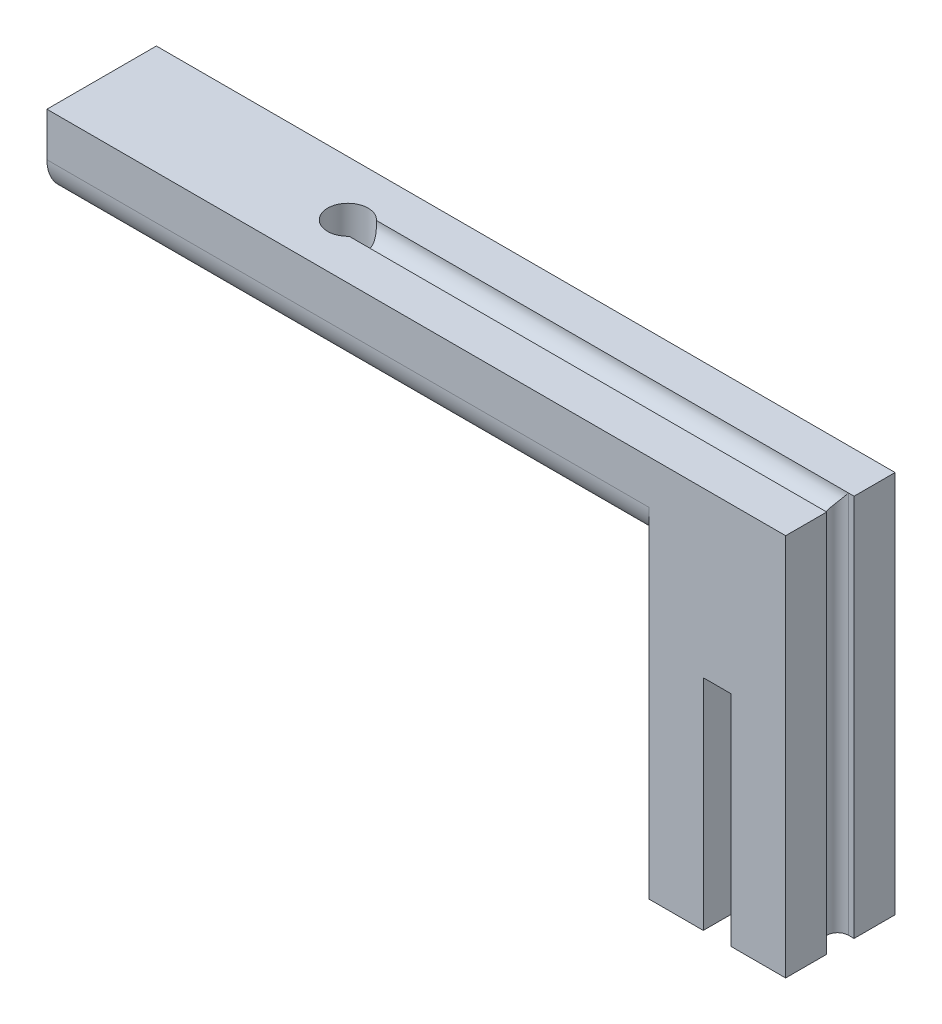
ISO-10303-21;
HEADER;
FILE_DESCRIPTION(('STEP AP214'),'2;1');
FILE_NAME('part.step','',(''),(''),'','','');
FILE_SCHEMA(('AUTOMOTIVE_DESIGN { 1 0 10303 214 1 1 1 1 }'));
ENDSEC;
DATA;
#1=APPLICATION_CONTEXT('core data for automotive mechanical design processes');
#2=APPLICATION_PROTOCOL_DEFINITION('international standard','automotive_design',2000,#1);
#3=PRODUCT_CONTEXT('',#1,'mechanical');
#4=PRODUCT('Part','Part','',(#3));
#5=PRODUCT_RELATED_PRODUCT_CATEGORY('part','',(#4));
#6=PRODUCT_DEFINITION_FORMATION('','',#4);
#7=PRODUCT_DEFINITION_CONTEXT('part definition',#1,'design');
#8=PRODUCT_DEFINITION('design','',#6,#7);
#9=PRODUCT_DEFINITION_SHAPE('','',#8);
#10=(LENGTH_UNIT() NAMED_UNIT(*) SI_UNIT(.MILLI.,.METRE.));
#11=(NAMED_UNIT(*) PLANE_ANGLE_UNIT() SI_UNIT($,.RADIAN.));
#12=(NAMED_UNIT(*) SI_UNIT($,.STERADIAN.) SOLID_ANGLE_UNIT());
#13=UNCERTAINTY_MEASURE_WITH_UNIT(LENGTH_MEASURE(1.E-05),#10,'distance_accuracy_value','');
#14=(GEOMETRIC_REPRESENTATION_CONTEXT(3) GLOBAL_UNCERTAINTY_ASSIGNED_CONTEXT((#13)) GLOBAL_UNIT_ASSIGNED_CONTEXT((#10,
#11,#12)) REPRESENTATION_CONTEXT('',''));
#15=CARTESIAN_POINT('',(0.,0.,0.));
#16=DIRECTION('',(0.,0.,1.));
#17=DIRECTION('',(1.,0.,0.));
#18=AXIS2_PLACEMENT_3D('',#15,#16,#17);
#19=CARTESIAN_POINT('',(0.,0.,20.));
#20=DIRECTION('',(-1.,0.,0.));
#21=DIRECTION('',(0.,0.,1.));
#22=AXIS2_PLACEMENT_3D('',#19,#20,#21);
#23=PLANE('',#22);
#24=DIRECTION('',(0.,0.,-1.));
#25=VECTOR('',#24,1.);
#26=CARTESIAN_POINT('',(0.,0.,20.));
#27=LINE('',#26,#25);
#28=CARTESIAN_POINT('',(0.,0.,20.));
#29=VERTEX_POINT('',#28);
#30=CARTESIAN_POINT('',(0.,0.,12.5));
#31=VERTEX_POINT('',#30);
#32=EDGE_CURVE('E267',#29,#31,#27,.T.);
#33=ORIENTED_EDGE('',*,*,#32,.T.);
#34=DIRECTION('',(0.,1.,0.));
#35=VECTOR('',#34,1.);
#36=CARTESIAN_POINT('',(0.,-5.83095189484531,12.5));
#37=LINE('',#36,#35);
#38=CARTESIAN_POINT('',(0.,70.,12.5));
#39=VERTEX_POINT('',#38);
#40=EDGE_CURVE('E121',#31,#39,#37,.T.);
#41=ORIENTED_EDGE('',*,*,#40,.T.);
#42=DIRECTION('',(0.,0.,-1.));
#43=VECTOR('',#42,1.);
#44=CARTESIAN_POINT('',(0.,70.,20.));
#45=LINE('',#44,#43);
#46=CARTESIAN_POINT('',(0.,70.,20.));
#47=VERTEX_POINT('',#46);
#48=EDGE_CURVE('E289',#47,#39,#45,.T.);
#49=ORIENTED_EDGE('',*,*,#48,.F.);
#50=DIRECTION('',(0.,1.,0.));
#51=VECTOR('',#50,1.);
#52=CARTESIAN_POINT('',(0.,0.,20.));
#53=LINE('',#52,#51);
#54=EDGE_CURVE('E274',#29,#47,#53,.T.);
#55=ORIENTED_EDGE('',*,*,#54,.F.);
#56=EDGE_LOOP('',(#33,#41,#49,#55));
#57=FACE_BOUND('',#56,.T.);
#58=ADVANCED_FACE('F44',(#57),#23,.F.);
#59=CARTESIAN_POINT('',(-135.,55.,20.));
#60=DIRECTION('',(0.,1.,0.));
#61=DIRECTION('',(0.,0.,1.));
#62=AXIS2_PLACEMENT_3D('',#59,#60,#61);
#63=PLANE('',#62);
#64=DIRECTION('',(1.,0.,0.));
#65=VECTOR('',#64,1.);
#66=CARTESIAN_POINT('',(-135.,55.,13.));
#67=LINE('',#66,#65);
#68=CARTESIAN_POINT('',(-25.,55.,13.));
#69=VERTEX_POINT('',#68);
#70=CARTESIAN_POINT('',(-87.8343592172293,55.,13.));
#71=VERTEX_POINT('',#70);
#72=EDGE_CURVE('E286',#69,#71,#67,.F.);
#73=ORIENTED_EDGE('',*,*,#72,.T.);
#74=CARTESIAN_POINT('',(-90.,55.,10.));
#75=DIRECTION('',(0.,1.,0.));
#76=DIRECTION('',(0.,0.,1.));
#77=AXIS2_PLACEMENT_3D('',#74,#75,#76);
#78=CIRCLE('',#77,3.69999999999999);
#79=CARTESIAN_POINT('',(-87.8343592172293,55.,7.));
#80=VERTEX_POINT('',#79);
#81=EDGE_CURVE('E338',#80,#71,#78,.F.);
#82=ORIENTED_EDGE('',*,*,#81,.F.);
#83=DIRECTION('',(1.,0.,0.));
#84=VECTOR('',#83,1.);
#85=CARTESIAN_POINT('',(-135.,55.,7.));
#86=LINE('',#85,#84);
#87=CARTESIAN_POINT('',(-25.,55.,7.));
#88=VERTEX_POINT('',#87);
#89=EDGE_CURVE('E295',#80,#88,#86,.T.);
#90=ORIENTED_EDGE('',*,*,#89,.T.);
#91=DIRECTION('',(0.,0.,-1.));
#92=VECTOR('',#91,1.);
#93=CARTESIAN_POINT('',(-25.,55.,20.));
#94=LINE('',#93,#92);
#95=EDGE_CURVE('E404',#69,#88,#94,.T.);
#96=ORIENTED_EDGE('',*,*,#95,.F.);
#97=EDGE_LOOP('',(#73,#82,#90,#96));
#98=FACE_BOUND('',#97,.T.);
#99=ADVANCED_FACE('F234',(#98),#63,.F.);
#100=CARTESIAN_POINT('',(-25.,0.,20.));
#101=DIRECTION('',(0.,1.,0.));
#102=DIRECTION('',(0.,0.,1.));
#103=AXIS2_PLACEMENT_3D('',#100,#101,#102);
#104=PLANE('',#103);
#105=DIRECTION('',(1.,0.,0.));
#106=VECTOR('',#105,1.);
#107=CARTESIAN_POINT('',(-25.,0.,0.));
#108=LINE('',#107,#106);
#109=CARTESIAN_POINT('',(-25.,0.,0.));
#110=VERTEX_POINT('',#109);
#111=CARTESIAN_POINT('',(-15.05,0.,0.));
#112=VERTEX_POINT('',#111);
#113=EDGE_CURVE('E380',#110,#112,#108,.T.);
#114=ORIENTED_EDGE('',*,*,#113,.T.);
#115=DIRECTION('',(0.,0.,1.));
#116=VECTOR('',#115,1.);
#117=CARTESIAN_POINT('',(-15.05,0.,-40.3238143037089));
#118=LINE('',#117,#116);
#119=CARTESIAN_POINT('',(-15.05,0.,20.));
#120=VERTEX_POINT('',#119);
#121=EDGE_CURVE('E486',#112,#120,#118,.T.);
#122=ORIENTED_EDGE('',*,*,#121,.T.);
#123=DIRECTION('',(1.,0.,0.));
#124=VECTOR('',#123,1.);
#125=CARTESIAN_POINT('',(-25.,0.,20.));
#126=LINE('',#125,#124);
#127=CARTESIAN_POINT('',(-25.,0.,20.));
#128=VERTEX_POINT('',#127);
#129=EDGE_CURVE('E518',#128,#120,#126,.T.);
#130=ORIENTED_EDGE('',*,*,#129,.F.);
#131=DIRECTION('',(0.,0.,-1.));
#132=VECTOR('',#131,1.);
#133=CARTESIAN_POINT('',(-25.,0.,20.));
#134=LINE('',#133,#132);
#135=EDGE_CURVE('E375',#128,#110,#134,.T.);
#136=ORIENTED_EDGE('',*,*,#135,.T.);
#137=EDGE_LOOP('',(#114,#122,#130,#136));
#138=FACE_BOUND('',#137,.T.);
#139=ADVANCED_FACE('F218',(#138),#104,.F.);
#140=DIRECTION('',(0.,0.,-1.));
#141=VECTOR('',#140,1.);
#142=CARTESIAN_POINT('',(-3.,0.,7.5));
#143=LINE('',#142,#141);
#144=CARTESIAN_POINT('',(-3.,0.,10.5));
#145=VERTEX_POINT('',#144);
#146=CARTESIAN_POINT('',(-3.,0.,9.5));
#147=VERTEX_POINT('',#146);
#148=EDGE_CURVE('E105',#145,#147,#143,.T.);
#149=ORIENTED_EDGE('',*,*,#148,.F.);
#150=CARTESIAN_POINT('',(-1.,0.,10.5));
#151=DIRECTION('',(0.,1.,0.));
#152=DIRECTION('',(0.,0.,1.));
#153=AXIS2_PLACEMENT_3D('',#150,#151,#152);
#154=CIRCLE('',#153,2.);
#155=CARTESIAN_POINT('',(-1.,0.,12.5));
#156=VERTEX_POINT('',#155);
#157=EDGE_CURVE('E94',#145,#156,#154,.T.);
#158=ORIENTED_EDGE('',*,*,#157,.T.);
#159=DIRECTION('',(-1.,0.,0.));
#160=VECTOR('',#159,1.);
#161=CARTESIAN_POINT('',(0.,0.,12.5));
#162=LINE('',#161,#160);
#163=EDGE_CURVE('E120',#31,#156,#162,.T.);
#164=ORIENTED_EDGE('',*,*,#163,.F.);
#165=ORIENTED_EDGE('',*,*,#32,.F.);
#166=CARTESIAN_POINT('',(-9.95,0.,20.));
#167=VERTEX_POINT('',#166);
#168=EDGE_CURVE('E400',#167,#29,#126,.T.);
#169=ORIENTED_EDGE('',*,*,#168,.F.);
#170=DIRECTION('',(0.,0.,1.));
#171=VECTOR('',#170,1.);
#172=CARTESIAN_POINT('',(-9.95,0.,-40.3238143037089));
#173=LINE('',#172,#171);
#174=CARTESIAN_POINT('',(-9.95,0.,0.));
#175=VERTEX_POINT('',#174);
#176=EDGE_CURVE('E513',#175,#167,#173,.T.);
#177=ORIENTED_EDGE('',*,*,#176,.F.);
#178=CARTESIAN_POINT('',(0.,0.,0.));
#179=VERTEX_POINT('',#178);
#180=EDGE_CURVE('E385',#175,#179,#108,.T.);
#181=ORIENTED_EDGE('',*,*,#180,.T.);
#182=CARTESIAN_POINT('',(0.,0.,7.5));
#183=VERTEX_POINT('',#182);
#184=EDGE_CURVE('E281',#183,#179,#27,.T.);
#185=ORIENTED_EDGE('',*,*,#184,.F.);
#186=DIRECTION('',(1.,0.,0.));
#187=VECTOR('',#186,1.);
#188=CARTESIAN_POINT('',(0.,0.,7.5));
#189=LINE('',#188,#187);
#190=CARTESIAN_POINT('',(-1.,0.,7.5));
#191=VERTEX_POINT('',#190);
#192=EDGE_CURVE('E107',#191,#183,#189,.T.);
#193=ORIENTED_EDGE('',*,*,#192,.F.);
#194=CARTESIAN_POINT('',(-1.,0.,9.5));
#195=DIRECTION('',(0.,1.,0.));
#196=DIRECTION('',(0.,0.,1.));
#197=AXIS2_PLACEMENT_3D('',#194,#195,#196);
#198=CIRCLE('',#197,2.);
#199=EDGE_CURVE('E11',#191,#147,#198,.T.);
#200=ORIENTED_EDGE('',*,*,#199,.T.);
#201=EDGE_LOOP('',(#149,#158,#164,#165,#169,#177,#181,#185,#193,#200));
#202=FACE_BOUND('',#201,.T.);
#203=ADVANCED_FACE('F104',(#202),#104,.F.);
#204=CARTESIAN_POINT('',(0.,70.,7.5));
#205=VERTEX_POINT('',#204);
#206=CARTESIAN_POINT('',(0.,70.,0.));
#207=VERTEX_POINT('',#206);
#208=EDGE_CURVE('E410',#205,#207,#45,.T.);
#209=ORIENTED_EDGE('',*,*,#208,.F.);
#210=DIRECTION('',(0.,1.,0.));
#211=VECTOR('',#210,1.);
#212=CARTESIAN_POINT('',(0.,-5.83095189484531,7.5));
#213=LINE('',#212,#211);
#214=EDGE_CURVE('E528',#183,#205,#213,.T.);
#215=ORIENTED_EDGE('',*,*,#214,.F.);
#216=ORIENTED_EDGE('',*,*,#184,.T.);
#217=DIRECTION('',(0.,1.,0.));
#218=VECTOR('',#217,1.);
#219=CARTESIAN_POINT('',(0.,0.,0.));
#220=LINE('',#219,#218);
#221=EDGE_CURVE('E384',#179,#207,#220,.T.);
#222=ORIENTED_EDGE('',*,*,#221,.T.);
#223=EDGE_LOOP('',(#209,#215,#216,#222));
#224=FACE_BOUND('',#223,.T.);
#225=ADVANCED_FACE('F217',(#224),#23,.F.);
#226=CARTESIAN_POINT('',(0.,70.,20.));
#227=DIRECTION('',(0.,-1.,0.));
#228=DIRECTION('',(1.,0.,0.));
#229=AXIS2_PLACEMENT_3D('',#226,#227,#228);
#230=PLANE('',#229);
#231=CARTESIAN_POINT('',(-90.,70.,10.));
#232=DIRECTION('',(0.,1.,0.));
#233=DIRECTION('',(-1.,0.,0.));
#234=AXIS2_PLACEMENT_3D('',#231,#232,#233);
#235=CIRCLE('',#234,3.69999999999999);
#236=CARTESIAN_POINT('',(-87.2723636606028,70.,7.5));
#237=VERTEX_POINT('',#236);
#238=CARTESIAN_POINT('',(-87.2723636606028,70.,12.5));
#239=VERTEX_POINT('',#238);
#240=EDGE_CURVE('E547',#237,#239,#235,.T.);
#241=ORIENTED_EDGE('',*,*,#240,.F.);
#242=DIRECTION('',(-1.,0.,0.));
#243=VECTOR('',#242,1.);
#244=CARTESIAN_POINT('',(-87.2723636606028,70.,7.5));
#245=LINE('',#244,#243);
#246=CARTESIAN_POINT('',(-1.,70.,7.5));
#247=VERTEX_POINT('',#246);
#248=EDGE_CURVE('E61',#247,#237,#245,.T.);
#249=ORIENTED_EDGE('',*,*,#248,.F.);
#250=EDGE_CURVE('E545',#205,#247,#245,.T.);
#251=ORIENTED_EDGE('',*,*,#250,.F.);
#252=ORIENTED_EDGE('',*,*,#208,.T.);
#253=DIRECTION('',(-1.,0.,0.));
#254=VECTOR('',#253,1.);
#255=CARTESIAN_POINT('',(0.,70.,0.));
#256=LINE('',#255,#254);
#257=CARTESIAN_POINT('',(-135.,70.,0.));
#258=VERTEX_POINT('',#257);
#259=EDGE_CURVE('E389',#207,#258,#256,.T.);
#260=ORIENTED_EDGE('',*,*,#259,.T.);
#261=DIRECTION('',(0.,0.,-1.));
#262=VECTOR('',#261,1.);
#263=CARTESIAN_POINT('',(-135.,70.,20.));
#264=LINE('',#263,#262);
#265=CARTESIAN_POINT('',(-135.,70.,20.));
#266=VERTEX_POINT('',#265);
#267=EDGE_CURVE('E408',#266,#258,#264,.T.);
#268=ORIENTED_EDGE('',*,*,#267,.F.);
#269=DIRECTION('',(-1.,0.,0.));
#270=VECTOR('',#269,1.);
#271=CARTESIAN_POINT('',(0.,70.,20.));
#272=LINE('',#271,#270);
#273=EDGE_CURVE('E368',#47,#266,#272,.T.);
#274=ORIENTED_EDGE('',*,*,#273,.F.);
#275=ORIENTED_EDGE('',*,*,#48,.T.);
#276=DIRECTION('',(1.,0.,0.));
#277=VECTOR('',#276,1.);
#278=CARTESIAN_POINT('',(0.,70.,12.5));
#279=LINE('',#278,#277);
#280=CARTESIAN_POINT('',(-1.,70.,12.5));
#281=VERTEX_POINT('',#280);
#282=EDGE_CURVE('E420',#281,#39,#279,.T.);
#283=ORIENTED_EDGE('',*,*,#282,.F.);
#284=DIRECTION('',(1.,0.,0.));
#285=VECTOR('',#284,1.);
#286=CARTESIAN_POINT('',(-87.2723636606028,70.,12.5));
#287=LINE('',#286,#285);
#288=EDGE_CURVE('E83',#239,#281,#287,.T.);
#289=ORIENTED_EDGE('',*,*,#288,.F.);
#290=EDGE_LOOP('',(#241,#249,#251,#252,#260,#268,#274,#275,#283,#289));
#291=FACE_BOUND('',#290,.T.);
#292=ADVANCED_FACE('F221',(#291),#230,.F.);
#293=CARTESIAN_POINT('',(-135.,70.,20.));
#294=DIRECTION('',(1.,0.,0.));
#295=DIRECTION('',(0.,0.,-1.));
#296=AXIS2_PLACEMENT_3D('',#293,#294,#295);
#297=PLANE('',#296);
#298=DIRECTION('',(0.,-1.,0.));
#299=VECTOR('',#298,1.);
#300=CARTESIAN_POINT('',(-135.,70.,0.));
#301=LINE('',#300,#299);
#302=CARTESIAN_POINT('',(-135.,62.,0.));
#303=VERTEX_POINT('',#302);
#304=EDGE_CURVE('E393',#258,#303,#301,.T.);
#305=ORIENTED_EDGE('',*,*,#304,.T.);
#306=CARTESIAN_POINT('',(-135.,62.,7.));
#307=DIRECTION('',(1.,0.,0.));
#308=DIRECTION('',(0.,0.,-1.));
#309=AXIS2_PLACEMENT_3D('',#306,#307,#308);
#310=CIRCLE('',#309,7.);
#311=CARTESIAN_POINT('',(-135.,55.,7.));
#312=VERTEX_POINT('',#311);
#313=EDGE_CURVE('E308',#303,#312,#310,.F.);
#314=ORIENTED_EDGE('',*,*,#313,.T.);
#315=DIRECTION('',(0.,0.,-1.));
#316=VECTOR('',#315,1.);
#317=CARTESIAN_POINT('',(-135.,55.,20.));
#318=LINE('',#317,#316);
#319=CARTESIAN_POINT('',(-135.,55.,13.));
#320=VERTEX_POINT('',#319);
#321=EDGE_CURVE('E361',#320,#312,#318,.T.);
#322=ORIENTED_EDGE('',*,*,#321,.F.);
#323=CARTESIAN_POINT('',(-135.,62.,13.));
#324=DIRECTION('',(1.,0.,0.));
#325=DIRECTION('',(0.,0.,-1.));
#326=AXIS2_PLACEMENT_3D('',#323,#324,#325);
#327=CIRCLE('',#326,7.);
#328=CARTESIAN_POINT('',(-135.,62.,20.));
#329=VERTEX_POINT('',#328);
#330=EDGE_CURVE('E304',#320,#329,#327,.F.);
#331=ORIENTED_EDGE('',*,*,#330,.T.);
#332=DIRECTION('',(0.,-1.,0.));
#333=VECTOR('',#332,1.);
#334=CARTESIAN_POINT('',(-135.,70.,20.));
#335=LINE('',#334,#333);
#336=EDGE_CURVE('E360',#266,#329,#335,.T.);
#337=ORIENTED_EDGE('',*,*,#336,.F.);
#338=ORIENTED_EDGE('',*,*,#267,.T.);
#339=EDGE_LOOP('',(#305,#314,#322,#331,#337,#338));
#340=FACE_BOUND('',#339,.T.);
#341=ADVANCED_FACE('F225',(#340),#297,.F.);
#342=CARTESIAN_POINT('',(-92.1656407827708,55.,7.));
#343=VERTEX_POINT('',#342);
#344=EDGE_CURVE('E296',#312,#343,#86,.T.);
#345=ORIENTED_EDGE('',*,*,#344,.T.);
#346=CARTESIAN_POINT('',(-92.1656407827708,55.,13.));
#347=VERTEX_POINT('',#346);
#348=EDGE_CURVE('E205',#347,#343,#78,.F.);
#349=ORIENTED_EDGE('',*,*,#348,.F.);
#350=EDGE_CURVE('E280',#347,#320,#67,.F.);
#351=ORIENTED_EDGE('',*,*,#350,.T.);
#352=ORIENTED_EDGE('',*,*,#321,.T.);
#353=EDGE_LOOP('',(#345,#349,#351,#352));
#354=FACE_BOUND('',#353,.T.);
#355=ADVANCED_FACE('F228',(#354),#63,.F.);
#356=CARTESIAN_POINT('',(-25.,55.,20.));
#357=DIRECTION('',(1.,0.,0.));
#358=DIRECTION('',(0.,1.,0.));
#359=AXIS2_PLACEMENT_3D('',#356,#357,#358);
#360=PLANE('',#359);
#361=DIRECTION('',(0.,-1.,0.));
#362=VECTOR('',#361,1.);
#363=CARTESIAN_POINT('',(-25.,55.,0.));
#364=LINE('',#363,#362);
#365=CARTESIAN_POINT('',(-25.,62.,0.));
#366=VERTEX_POINT('',#365);
#367=EDGE_CURVE('E396',#366,#110,#364,.T.);
#368=ORIENTED_EDGE('',*,*,#367,.T.);
#369=ORIENTED_EDGE('',*,*,#135,.F.);
#370=DIRECTION('',(0.,-1.,0.));
#371=VECTOR('',#370,1.);
#372=CARTESIAN_POINT('',(-25.,55.,20.));
#373=LINE('',#372,#371);
#374=CARTESIAN_POINT('',(-25.,62.,20.));
#375=VERTEX_POINT('',#374);
#376=EDGE_CURVE('E371',#375,#128,#373,.T.);
#377=ORIENTED_EDGE('',*,*,#376,.F.);
#378=CARTESIAN_POINT('',(-25.,62.,13.));
#379=DIRECTION('',(1.,0.,0.));
#380=DIRECTION('',(0.,1.,0.));
#381=AXIS2_PLACEMENT_3D('',#378,#379,#380);
#382=CIRCLE('',#381,7.);
#383=EDGE_CURVE('E319',#375,#69,#382,.T.);
#384=ORIENTED_EDGE('',*,*,#383,.T.);
#385=ORIENTED_EDGE('',*,*,#95,.T.);
#386=CARTESIAN_POINT('',(-25.,62.,7.));
#387=DIRECTION('',(1.,0.,0.));
#388=DIRECTION('',(0.,1.,0.));
#389=AXIS2_PLACEMENT_3D('',#386,#387,#388);
#390=CIRCLE('',#389,7.);
#391=EDGE_CURVE('E316',#88,#366,#390,.T.);
#392=ORIENTED_EDGE('',*,*,#391,.T.);
#393=EDGE_LOOP('',(#368,#369,#377,#384,#385,#392));
#394=FACE_BOUND('',#393,.T.);
#395=ADVANCED_FACE('F232',(#394),#360,.F.);
#396=CARTESIAN_POINT('',(0.,0.,20.));
#397=DIRECTION('',(0.,0.,1.));
#398=DIRECTION('',(1.,0.,0.));
#399=AXIS2_PLACEMENT_3D('',#396,#397,#398);
#400=PLANE('',#399);
#401=ORIENTED_EDGE('',*,*,#336,.T.);
#402=DIRECTION('',(1.,0.,0.));
#403=VECTOR('',#402,1.);
#404=CARTESIAN_POINT('',(-25.,62.,20.));
#405=LINE('',#404,#403);
#406=EDGE_CURVE('E312',#329,#375,#405,.T.);
#407=ORIENTED_EDGE('',*,*,#406,.T.);
#408=ORIENTED_EDGE('',*,*,#376,.T.);
#409=ORIENTED_EDGE('',*,*,#129,.T.);
#410=DIRECTION('',(0.,-1.,0.));
#411=VECTOR('',#410,1.);
#412=CARTESIAN_POINT('',(-15.05,0.,20.));
#413=LINE('',#412,#411);
#414=CARTESIAN_POINT('',(-15.05,40.,20.));
#415=VERTEX_POINT('',#414);
#416=EDGE_CURVE('E204',#415,#120,#413,.T.);
#417=ORIENTED_EDGE('',*,*,#416,.F.);
#418=DIRECTION('',(-1.,0.,0.));
#419=VECTOR('',#418,1.);
#420=CARTESIAN_POINT('',(-15.05,40.,20.));
#421=LINE('',#420,#419);
#422=CARTESIAN_POINT('',(-9.95,40.,20.));
#423=VERTEX_POINT('',#422);
#424=EDGE_CURVE('E494',#423,#415,#421,.T.);
#425=ORIENTED_EDGE('',*,*,#424,.F.);
#426=DIRECTION('',(0.,1.,0.));
#427=VECTOR('',#426,1.);
#428=CARTESIAN_POINT('',(-9.95,0.,20.));
#429=LINE('',#428,#427);
#430=EDGE_CURVE('E505',#167,#423,#429,.T.);
#431=ORIENTED_EDGE('',*,*,#430,.F.);
#432=ORIENTED_EDGE('',*,*,#168,.T.);
#433=ORIENTED_EDGE('',*,*,#54,.T.);
#434=ORIENTED_EDGE('',*,*,#273,.T.);
#435=EDGE_LOOP('',(#401,#407,#408,#409,#417,#425,#431,#432,#433,#434));
#436=FACE_BOUND('',#435,.T.);
#437=ADVANCED_FACE('F237',(#436),#400,.T.);
#438=CARTESIAN_POINT('',(0.,0.,0.));
#439=DIRECTION('',(0.,0.,1.));
#440=DIRECTION('',(1.,0.,0.));
#441=AXIS2_PLACEMENT_3D('',#438,#439,#440);
#442=PLANE('',#441);
#443=ORIENTED_EDGE('',*,*,#367,.F.);
#444=DIRECTION('',(1.,0.,0.));
#445=VECTOR('',#444,1.);
#446=CARTESIAN_POINT('',(0.,62.,0.));
#447=LINE('',#446,#445);
#448=EDGE_CURVE('E300',#366,#303,#447,.F.);
#449=ORIENTED_EDGE('',*,*,#448,.T.);
#450=ORIENTED_EDGE('',*,*,#304,.F.);
#451=ORIENTED_EDGE('',*,*,#259,.F.);
#452=ORIENTED_EDGE('',*,*,#221,.F.);
#453=ORIENTED_EDGE('',*,*,#180,.F.);
#454=DIRECTION('',(0.,-1.,0.));
#455=VECTOR('',#454,1.);
#456=CARTESIAN_POINT('',(-9.95,0.,0.));
#457=LINE('',#456,#455);
#458=CARTESIAN_POINT('',(-9.95,40.,0.));
#459=VERTEX_POINT('',#458);
#460=EDGE_CURVE('E207',#459,#175,#457,.T.);
#461=ORIENTED_EDGE('',*,*,#460,.F.);
#462=DIRECTION('',(1.,0.,0.));
#463=VECTOR('',#462,1.);
#464=CARTESIAN_POINT('',(-15.05,40.,0.));
#465=LINE('',#464,#463);
#466=CARTESIAN_POINT('',(-15.05,40.,0.));
#467=VERTEX_POINT('',#466);
#468=EDGE_CURVE('E489',#467,#459,#465,.T.);
#469=ORIENTED_EDGE('',*,*,#468,.F.);
#470=DIRECTION('',(0.,1.,0.));
#471=VECTOR('',#470,1.);
#472=CARTESIAN_POINT('',(-15.05,0.,0.));
#473=LINE('',#472,#471);
#474=EDGE_CURVE('E481',#112,#467,#473,.T.);
#475=ORIENTED_EDGE('',*,*,#474,.F.);
#476=ORIENTED_EDGE('',*,*,#113,.F.);
#477=EDGE_LOOP('',(#443,#449,#450,#451,#452,#453,#461,#469,#475,#476));
#478=FACE_BOUND('',#477,.T.);
#479=ADVANCED_FACE('F239',(#478),#442,.F.);
#480=CARTESIAN_POINT('',(-15.05,0.,-40.3238143037089));
#481=DIRECTION('',(-1.,0.,0.));
#482=DIRECTION('',(0.,-1.,0.));
#483=AXIS2_PLACEMENT_3D('',#480,#481,#482);
#484=PLANE('',#483);
#485=ORIENTED_EDGE('',*,*,#474,.T.);
#486=DIRECTION('',(0.,0.,1.));
#487=VECTOR('',#486,1.);
#488=CARTESIAN_POINT('',(-15.05,40.,-40.3238143037089));
#489=LINE('',#488,#487);
#490=EDGE_CURVE('E483',#467,#415,#489,.T.);
#491=ORIENTED_EDGE('',*,*,#490,.T.);
#492=ORIENTED_EDGE('',*,*,#416,.T.);
#493=ORIENTED_EDGE('',*,*,#121,.F.);
#494=EDGE_LOOP('',(#485,#491,#492,#493));
#495=FACE_BOUND('',#494,.T.);
#496=ADVANCED_FACE('F242',(#495),#484,.F.);
#497=CARTESIAN_POINT('',(-15.05,40.,-40.3238143037089));
#498=DIRECTION('',(0.,1.,0.));
#499=DIRECTION('',(0.,0.,1.));
#500=AXIS2_PLACEMENT_3D('',#497,#498,#499);
#501=PLANE('',#500);
#502=ORIENTED_EDGE('',*,*,#468,.T.);
#503=DIRECTION('',(0.,0.,1.));
#504=VECTOR('',#503,1.);
#505=CARTESIAN_POINT('',(-9.95,40.,-40.3238143037089));
#506=LINE('',#505,#504);
#507=EDGE_CURVE('E497',#459,#423,#506,.T.);
#508=ORIENTED_EDGE('',*,*,#507,.T.);
#509=ORIENTED_EDGE('',*,*,#424,.T.);
#510=ORIENTED_EDGE('',*,*,#490,.F.);
#511=EDGE_LOOP('',(#502,#508,#509,#510));
#512=FACE_BOUND('',#511,.T.);
#513=ADVANCED_FACE('F189',(#512),#501,.F.);
#514=CARTESIAN_POINT('',(-9.95,0.,-40.3238143037089));
#515=DIRECTION('',(1.,0.,0.));
#516=DIRECTION('',(0.,0.,-1.));
#517=AXIS2_PLACEMENT_3D('',#514,#515,#516);
#518=PLANE('',#517);
#519=ORIENTED_EDGE('',*,*,#460,.T.);
#520=ORIENTED_EDGE('',*,*,#176,.T.);
#521=ORIENTED_EDGE('',*,*,#430,.T.);
#522=ORIENTED_EDGE('',*,*,#507,.F.);
#523=EDGE_LOOP('',(#519,#520,#521,#522));
#524=FACE_BOUND('',#523,.T.);
#525=ADVANCED_FACE('F213',(#524),#518,.F.);
#526=CARTESIAN_POINT('',(-135.,62.,7.));
#527=DIRECTION('',(1.,0.,0.));
#528=DIRECTION('',(0.,0.,-1.));
#529=AXIS2_PLACEMENT_3D('',#526,#527,#528);
#530=CYLINDRICAL_SURFACE('',#529,7.);
#531=CARTESIAN_POINT('',(-92.1656407827708,55.,7.));
#532=CARTESIAN_POINT('',(-92.081358554252,55.0000067149163,6.93914604137916));
#533=CARTESIAN_POINT('',(-91.9945094538481,55.0007938871628,6.8818669396977));
#534=CARTESIAN_POINT('',(-91.8163231717103,55.0034160415689,6.77482519262651));
#535=CARTESIAN_POINT('',(-91.7249864770679,55.0052509102382,6.72506173385362));
#536=CARTESIAN_POINT('',(-91.5384879973849,55.0094547680912,6.63342229792254));
#537=CARTESIAN_POINT('',(-91.4433276965475,55.0118235516407,6.59154329548016));
#538=CARTESIAN_POINT('',(-91.249852562025,55.0166548859953,6.51594046624085));
#539=CARTESIAN_POINT('',(-91.1515377177065,55.0191174371164,6.48221666693725));
#540=CARTESIAN_POINT('',(-90.8528023886652,55.0260515595879,6.39364788603622));
#541=CARTESIAN_POINT('',(-90.648482481488,55.0300729519422,6.35135226431503));
#542=CARTESIAN_POINT('',(-90.2357764094102,55.03487591116,6.30166970512365));
#543=CARTESIAN_POINT('',(-90.0273916864215,55.0356586066188,6.29427060706387));
#544=CARTESIAN_POINT('',(-89.6127251833564,55.033640018143,6.31448563269081));
#545=CARTESIAN_POINT('',(-89.4064402133615,55.0308453960096,6.34203467391939));
#546=CARTESIAN_POINT('',(-89.0014106024623,55.0229999545432,6.43127445275289));
#547=CARTESIAN_POINT('',(-88.8026652859669,55.0179493378792,6.49296212360612));
#548=CARTESIAN_POINT('',(-88.4731084810762,55.0097518006582,6.62648210838687));
#549=CARTESIAN_POINT('',(-88.3390516321158,55.0064719761473,6.69043994902208));
#550=CARTESIAN_POINT('',(-88.0797334004161,55.0016126971203,6.83384393158905));
#551=CARTESIAN_POINT('',(-87.9544589459976,55.0000306631415,6.91326636054537));
#552=CARTESIAN_POINT('',(-87.8343592172293,55.,7.));
#553=B_SPLINE_CURVE_WITH_KNOTS('',3,(#531,#532,#533,#534,#535,#536,#537,#538,#539,#540,#541,
#542,#543,#544,#545,#546,#547,#548,#549,#550,#551,#552),.UNSPECIFIED.,.F.,.F.,(4,2,2,2,2,2,2,2,
2,2,4),(0.,0.31175276275934,0.623471761749084,0.935070908574893,1.24667110586866,
1.86951298266636,2.49213779817643,3.11360482582003,3.73501603470989,4.17970022149286,
4.62370783645432),.UNSPECIFIED.);
#554=EDGE_CURVE('E195',#343,#80,#553,.T.);
#555=ORIENTED_EDGE('',*,*,#554,.F.);
#556=ORIENTED_EDGE('',*,*,#344,.F.);
#557=ORIENTED_EDGE('',*,*,#313,.F.);
#558=ORIENTED_EDGE('',*,*,#448,.F.);
#559=ORIENTED_EDGE('',*,*,#391,.F.);
#560=ORIENTED_EDGE('',*,*,#89,.F.);
#561=EDGE_LOOP('',(#555,#556,#557,#558,#559,#560));
#562=FACE_BOUND('',#561,.T.);
#563=ADVANCED_FACE('F209',(#562),#530,.T.);
#564=CARTESIAN_POINT('',(0.,62.,13.));
#565=DIRECTION('',(-1.,0.,0.));
#566=DIRECTION('',(0.,0.,1.));
#567=AXIS2_PLACEMENT_3D('',#564,#565,#566);
#568=CYLINDRICAL_SURFACE('',#567,7.);
#569=CARTESIAN_POINT('',(-87.8343592172293,55.,13.));
#570=CARTESIAN_POINT('',(-87.9186414457481,55.0000067149163,13.0608539586208));
#571=CARTESIAN_POINT('',(-88.005490546152,55.0007938871628,13.1181330603023));
#572=CARTESIAN_POINT('',(-88.1836768282898,55.0034160415689,13.2251748073735));
#573=CARTESIAN_POINT('',(-88.2750135229322,55.0052509102382,13.2749382661464));
#574=CARTESIAN_POINT('',(-88.4615120026152,55.0094547680912,13.3665777020775));
#575=CARTESIAN_POINT('',(-88.5566723034526,55.0118235516407,13.4084567045198));
#576=CARTESIAN_POINT('',(-88.750147437975,55.0166548859953,13.4840595337592));
#577=CARTESIAN_POINT('',(-88.8484622822936,55.0191174371164,13.5177833330628));
#578=CARTESIAN_POINT('',(-89.1471976113348,55.0260515595879,13.6063521139638));
#579=CARTESIAN_POINT('',(-89.351517518512,55.0300729519422,13.648647735685));
#580=CARTESIAN_POINT('',(-89.7642235905899,55.03487591116,13.6983302948763));
#581=CARTESIAN_POINT('',(-89.9726083135785,55.0356586066188,13.7057293929361));
#582=CARTESIAN_POINT('',(-90.3872748166437,55.033640018143,13.6855143673092));
#583=CARTESIAN_POINT('',(-90.5935597866386,55.0308453960096,13.6579653260806));
#584=CARTESIAN_POINT('',(-90.9985893975378,55.0229999545432,13.5687255472471));
#585=CARTESIAN_POINT('',(-91.1973347140332,55.0179493378792,13.5070378763939));
#586=CARTESIAN_POINT('',(-91.5268915189238,55.0097518006582,13.3735178916131));
#587=CARTESIAN_POINT('',(-91.6609483678842,55.0064719761473,13.3095600509779));
#588=CARTESIAN_POINT('',(-91.920266599584,55.0016126971203,13.1661560684109));
#589=CARTESIAN_POINT('',(-92.0455410540025,55.0000306631415,13.0867336394546));
#590=CARTESIAN_POINT('',(-92.1656407827708,55.,13.));
#591=B_SPLINE_CURVE_WITH_KNOTS('',3,(#569,#570,#571,#572,#573,#574,#575,#576,#577,#578,#579,
#580,#581,#582,#583,#584,#585,#586,#587,#588,#589,#590),.UNSPECIFIED.,.F.,.F.,(4,2,2,2,2,2,2,2,
2,2,4),(0.,0.311752762759359,0.623471761749103,0.935070908574896,1.24667110586866,
1.86951298266638,2.49213779817644,3.11360482582003,3.73501603470989,4.17970022149288,
4.62370783645433),.UNSPECIFIED.);
#592=EDGE_CURVE('E170',#71,#347,#591,.T.);
#593=ORIENTED_EDGE('',*,*,#592,.F.);
#594=ORIENTED_EDGE('',*,*,#72,.F.);
#595=ORIENTED_EDGE('',*,*,#383,.F.);
#596=ORIENTED_EDGE('',*,*,#406,.F.);
#597=ORIENTED_EDGE('',*,*,#330,.F.);
#598=ORIENTED_EDGE('',*,*,#350,.F.);
#599=EDGE_LOOP('',(#593,#594,#595,#596,#597,#598));
#600=FACE_BOUND('',#599,.T.);
#601=ADVANCED_FACE('F153',(#600),#568,.T.);
#602=CARTESIAN_POINT('',(-90.,44.5348196384391,10.));
#603=DIRECTION('',(0.,1.,0.));
#604=DIRECTION('',(-1.,0.,0.));
#605=AXIS2_PLACEMENT_3D('',#602,#603,#604);
#606=CYLINDRICAL_SURFACE('',#605,3.69999999999999);
#607=ORIENTED_EDGE('',*,*,#554,.T.);
#608=ORIENTED_EDGE('',*,*,#81,.T.);
#609=ORIENTED_EDGE('',*,*,#592,.T.);
#610=ORIENTED_EDGE('',*,*,#348,.T.);
#611=EDGE_LOOP('',(#607,#608,#609,#610));
#612=FACE_BOUND('',#611,.T.);
#613=CARTESIAN_POINT('',(-87.2723636606028,70.,12.5));
#614=CARTESIAN_POINT('',(-87.2724119003108,69.9257959853325,12.500020092964));
#615=CARTESIAN_POINT('',(-87.269841467702,69.8516218743606,12.4972478434206));
#616=CARTESIAN_POINT('',(-87.2598360678476,69.7041169836679,12.4862822310371));
#617=CARTESIAN_POINT('',(-87.2524086153843,69.6307850789459,12.4780972425676));
#618=CARTESIAN_POINT('',(-87.2331623124902,69.4862840462693,12.4565833271121));
#619=CARTESIAN_POINT('',(-87.2213907948819,69.4151002392204,12.4433097864546));
#620=CARTESIAN_POINT('',(-87.194049185827,69.2745685946836,12.411861623376));
#621=CARTESIAN_POINT('',(-87.1784777790005,69.2052214021979,12.3936853035655));
#622=CARTESIAN_POINT('',(-87.1272750757235,69.0013331889901,12.3324378404477));
#623=CARTESIAN_POINT('',(-87.0870081307384,68.8699633328402,12.2824964304493));
#624=CARTESIAN_POINT('',(-86.9993026731896,68.6170869043678,12.1659055426247));
#625=CARTESIAN_POINT('',(-86.9518399900702,68.4956157801944,12.0991992349406));
#626=CARTESIAN_POINT('',(-86.8462465914792,68.2439758702103,11.9376925400573));
#627=CARTESIAN_POINT('',(-86.7876692589346,68.1158107205506,11.8400487330327));
#628=CARTESIAN_POINT('',(-86.6736134912252,67.8760568149719,11.6247999992961));
#629=CARTESIAN_POINT('',(-86.6181324895461,67.7644541992902,11.5072119408356));
#630=CARTESIAN_POINT('',(-86.5206401970976,67.5694331162785,11.2647386944218));
#631=CARTESIAN_POINT('',(-86.4778631572607,67.4843753712808,11.1414865723783));
#632=CARTESIAN_POINT('',(-86.4038361766437,67.3324252567032,10.8808377489533));
#633=CARTESIAN_POINT('',(-86.3725842848415,67.2655298130443,10.7434434466571));
#634=CARTESIAN_POINT('',(-86.3372293150675,67.1807989572445,10.5286580823469));
#635=CARTESIAN_POINT('',(-86.3273450564212,67.1550698284436,10.4552302022769));
#636=CARTESIAN_POINT('',(-86.3119322052297,67.1093047701576,10.3061900400101));
#637=CARTESIAN_POINT('',(-86.306401255991,67.0892657640474,10.2305789627182));
#638=CARTESIAN_POINT('',(-86.3000345952179,67.0551667040875,10.0779808887929));
#639=CARTESIAN_POINT('',(-86.2991899867037,67.0410953676272,10.000996777937));
#640=CARTESIAN_POINT('',(-86.3023856695153,67.0190323729029,9.84630337751303));
#641=CARTESIAN_POINT('',(-86.3064221221246,67.0110359450685,9.76859470544507));
#642=CARTESIAN_POINT('',(-86.3156037409156,67.0040478880145,9.65904327449257));
#643=CARTESIAN_POINT('',(-86.318693196296,67.0025267285879,9.62716256269549));
#644=CARTESIAN_POINT('',(-86.3256980751435,67.0005035218089,9.56350423249874));
#645=CARTESIAN_POINT('',(-86.3296123501884,67.0000000676916,9.53172653249522));
#646=CARTESIAN_POINT('',(-86.3339394440354,67.,9.5));
#647=B_SPLINE_CURVE_WITH_KNOTS('',3,(#613,#614,#615,#616,#617,#618,#619,#620,#621,#622,#623,
#624,#625,#626,#627,#628,#629,#630,#631,#632,#633,#634,#635,#636,#637,#638,#639,#640,#641,#642,
#643,#644,#645,#646),.UNSPECIFIED.,.F.,.F.,(4,2,2,2,2,2,2,2,2,2,2,2,2,2,2,2,4),(0.,
0.222467677181625,0.444591964125983,0.664364201804282,0.884212624623821,1.32093359537335,
1.75915542092073,2.27149364148217,2.78340068295952,3.24880842669133,3.71413734818025,
3.94913000247157,4.18399535422916,4.41841466306496,4.65264973239105,4.74882656307485,
4.84487035824534),.UNSPECIFIED.);
#648=CARTESIAN_POINT('',(-86.3,67.0419601084502,10.));
#649=VERTEX_POINT('',#648);
#650=EDGE_CURVE('E159',#239,#649,#647,.T.);
#651=ORIENTED_EDGE('',*,*,#650,.T.);
#652=CARTESIAN_POINT('',(-86.3339394440354,67.,10.5));
#653=CARTESIAN_POINT('',(-86.3244932850996,66.9999851546836,10.4308537154914));
#654=CARTESIAN_POINT('',(-86.3170339792202,67.0023902908491,10.3614389288288));
#655=CARTESIAN_POINT('',(-86.3060540802767,67.0120416174726,10.2226588746318));
#656=CARTESIAN_POINT('',(-86.3025320995369,67.0192861009063,10.1532935982671));
#657=CARTESIAN_POINT('',(-86.2993945888973,67.0385598282643,10.0155595277738));
#658=CARTESIAN_POINT('',(-86.299755995755,67.0505604162832,9.94718726274855));
#659=CARTESIAN_POINT('',(-86.3041773660811,67.0792338544813,9.81156953109114));
#660=CARTESIAN_POINT('',(-86.3082374205385,67.095906819597,9.74432409222103));
#661=CARTESIAN_POINT('',(-86.325656752152,67.1526767228337,9.54514962244934));
#662=CARTESIAN_POINT('',(-86.3442507636328,67.1995612783502,9.41552417710046));
#663=CARTESIAN_POINT('',(-86.3930271850194,67.3095717948791,9.16571983016365));
#664=CARTESIAN_POINT('',(-86.4232226623247,67.3727160435753,9.04555176552745));
#665=CARTESIAN_POINT('',(-86.494313812475,67.5172584863984,8.80997692733649));
#666=CARTESIAN_POINT('',(-86.5357278068212,67.5995019104023,8.69524870537929));
#667=CARTESIAN_POINT('',(-86.6247287963456,67.7777990521618,8.47974754629137));
#668=CARTESIAN_POINT('',(-86.6723209544532,67.8738643278341,8.37898642838576));
#669=CARTESIAN_POINT('',(-86.779421828027,68.0979475451286,8.17416986386657));
#670=CARTESIAN_POINT('',(-86.8394601564612,68.2285559760339,8.07321817209354));
#671=CARTESIAN_POINT('',(-86.9563338110093,68.5056373093933,7.89344233014025));
#672=CARTESIAN_POINT('',(-87.0131687132625,68.6521123037719,7.81462110268057));
#673=CARTESIAN_POINT('',(-87.1053855608685,68.9291530942217,7.6944032254485));
#674=CARTESIAN_POINT('',(-87.1427879703615,69.057165678833,7.64869248445872));
#675=CARTESIAN_POINT('',(-87.2052896511992,69.3207813546909,7.57472158637334));
#676=CARTESIAN_POINT('',(-87.2304318100234,69.4563561102875,7.54640050719221));
#677=CARTESIAN_POINT('',(-87.2555425118175,69.660992269325,7.51844910289766));
#678=CARTESIAN_POINT('',(-87.2618073050121,69.7283672748883,7.51155438731704));
#679=CARTESIAN_POINT('',(-87.2702346192721,69.8638125742336,7.50232142671512));
#680=CARTESIAN_POINT('',(-87.2723891735413,69.9318839617041,7.49999203032483));
#681=CARTESIAN_POINT('',(-87.2723636606029,70.,7.5));
#682=B_SPLINE_CURVE_WITH_KNOTS('',3,(#652,#653,#654,#655,#656,#657,#658,#659,#660,#661,#662,
#663,#664,#665,#666,#667,#668,#669,#670,#671,#672,#673,#674,#675,#676,#677,#678,#679,#680,#681),
.UNSPECIFIED.,.F.,.F.,(4,2,2,2,2,2,2,2,2,2,2,2,2,2,4),(0.,0.209290295438868,0.418506805077952,
0.626481478540455,0.83446126844944,1.24964863759883,1.66530503370479,2.10502838519659,
2.54512159641117,3.06998336470257,3.59491441773477,4.01639920826139,4.4363988367319,
4.64019656646874,4.84438891361745),.UNSPECIFIED.);
#683=EDGE_CURVE('E169',#649,#237,#682,.T.);
#684=ORIENTED_EDGE('',*,*,#683,.T.);
#685=ORIENTED_EDGE('',*,*,#240,.T.);
#686=EDGE_LOOP('',(#651,#684,#685));
#687=FACE_BOUND('',#686,.T.);
#688=ADVANCED_FACE('F181',(#612,#687),#606,.F.);
#689=CARTESIAN_POINT('',(0.,70.,10.5));
#690=DIRECTION('',(-1.,0.,0.));
#691=DIRECTION('',(0.,-1.,0.));
#692=AXIS2_PLACEMENT_3D('',#689,#690,#691);
#693=CYLINDRICAL_SURFACE('',#692,3.);
#694=DIRECTION('',(-1.,0.,0.));
#695=VECTOR('',#694,1.);
#696=CARTESIAN_POINT('',(-43.7204610189564,67.0419601084502,10.));
#697=LINE('',#696,#695);
#698=CARTESIAN_POINT('',(-3.00000000000001,67.0419601084502,10.));
#699=VERTEX_POINT('',#698);
#700=EDGE_CURVE('E542',#699,#649,#697,.T.);
#701=ORIENTED_EDGE('',*,*,#700,.F.);
#702=CARTESIAN_POINT('',(-3.00000000000001,70.,10.5));
#703=DIRECTION('',(-1.,0.,0.));
#704=DIRECTION('',(0.,-1.,0.));
#705=AXIS2_PLACEMENT_3D('',#702,#703,#704);
#706=CIRCLE('',#705,3.);
#707=CARTESIAN_POINT('',(-3.00000000000001,67.1715728752538,9.5));
#708=VERTEX_POINT('',#707);
#709=EDGE_CURVE('E539',#699,#708,#706,.F.);
#710=ORIENTED_EDGE('',*,*,#709,.T.);
#711=CARTESIAN_POINT('',(-3.00000000000001,67.1715728752538,9.5));
#712=CARTESIAN_POINT('',(-3.00000844496492,67.1914929497312,9.44361594444744));
#713=CARTESIAN_POINT('',(-2.99761652904293,67.2131130269519,9.38786909475856));
#714=CARTESIAN_POINT('',(-2.98841610313973,67.2594527877804,9.27814902785897));
#715=CARTESIAN_POINT('',(-2.98161435571983,67.2841676786853,9.22417322764303));
#716=CARTESIAN_POINT('',(-2.9640650089645,67.3361956754575,9.11885296789474));
#717=CARTESIAN_POINT('',(-2.95335787821593,67.3634800776253,9.0674874674884));
#718=CARTESIAN_POINT('',(-2.92838334308602,67.4205700811913,8.9670669910103));
#719=CARTESIAN_POINT('',(-2.91411426132944,67.450376866033,8.91801311649194));
#720=CARTESIAN_POINT('',(-2.85932690635693,67.5572352048067,8.75289315377526));
#721=CARTESIAN_POINT('',(-2.81079912360126,67.6399906912698,8.64304885768412));
#722=CARTESIAN_POINT('',(-2.69957987089102,67.8155281833449,8.43933803827304));
#723=CARTESIAN_POINT('',(-2.63682567502974,67.9083536135628,8.34554560467289));
#724=CARTESIAN_POINT('',(-2.47493331699464,68.1383076033461,8.14074279636961));
#725=CARTESIAN_POINT('',(-2.37111021202546,68.2786858419373,8.03710272129047));
#726=CARTESIAN_POINT('',(-2.1512915720566,68.5677782905414,7.85846668206519));
#727=CARTESIAN_POINT('',(-2.03527922818271,68.7165038763629,7.78351095210631));
#728=CARTESIAN_POINT('',(-1.84324192747763,68.9591137223494,7.68463330967702));
#729=CARTESIAN_POINT('',(-1.76950503352207,69.051476915592,7.65224520363727));
#730=CARTESIAN_POINT('',(-1.6201250475231,69.2374872110456,7.59689779523985));
#731=CARTESIAN_POINT('',(-1.54448133438127,69.3311347269431,7.57394160833673));
#732=CARTESIAN_POINT('',(-1.31606597565947,69.6128902505382,7.51894485126977));
#733=CARTESIAN_POINT('',(-1.16134914227686,69.8023883258892,7.5005465936659));
#734=CARTESIAN_POINT('',(-1.00461873135707,69.9943432302401,7.50000400481877));
#735=CARTESIAN_POINT('',(-1.00230932774509,69.997171660416,7.50000000521536));
#736=CARTESIAN_POINT('',(-1.00000000000001,70.,7.5));
#737=B_SPLINE_CURVE_WITH_KNOTS('',3,(#711,#712,#713,#714,#715,#716,#717,#718,#719,#720,#721,
#722,#723,#724,#725,#726,#727,#728,#729,#730,#731,#732,#733,#734,#735,#736),.UNSPECIFIED.,.F.,
.F.,(4,2,2,2,2,2,2,2,2,2,2,2,4),(0.,0.17927215882421,0.358270048541692,0.535463494925232,
0.712740542250152,1.14766579663325,1.58454732757418,2.19039501983588,2.79708941843103,
3.16434808038174,3.53172795410126,4.26418943717289,4.2751438948957),.UNSPECIFIED.);
#738=EDGE_CURVE('E54',#708,#247,#737,.T.);
#739=ORIENTED_EDGE('',*,*,#738,.T.);
#740=ORIENTED_EDGE('',*,*,#248,.T.);
#741=ORIENTED_EDGE('',*,*,#683,.F.);
#742=EDGE_LOOP('',(#701,#710,#739,#740,#741));
#743=FACE_BOUND('',#742,.T.);
#744=ADVANCED_FACE('F152',(#743),#693,.F.);
#745=CARTESIAN_POINT('',(0.,70.,9.5));
#746=DIRECTION('',(1.,0.,0.));
#747=DIRECTION('',(0.,1.,0.));
#748=AXIS2_PLACEMENT_3D('',#745,#746,#747);
#749=CYLINDRICAL_SURFACE('',#748,3.);
#750=ORIENTED_EDGE('',*,*,#288,.T.);
#751=CARTESIAN_POINT('',(-3.00000000000001,67.1715728752538,10.5));
#752=CARTESIAN_POINT('',(-3.00000844496492,67.1914929497312,10.5563840555526));
#753=CARTESIAN_POINT('',(-2.99761652904293,67.213113026952,10.6121309052414));
#754=CARTESIAN_POINT('',(-2.98841610313973,67.2594527877804,10.7218509721411));
#755=CARTESIAN_POINT('',(-2.98161435571983,67.2841676786853,10.775826772357));
#756=CARTESIAN_POINT('',(-2.9640650089645,67.3361956754575,10.8811470321053));
#757=CARTESIAN_POINT('',(-2.95335787821592,67.3634800776253,10.9325125325116));
#758=CARTESIAN_POINT('',(-2.92838334308602,67.4205700811913,11.0329330089897));
#759=CARTESIAN_POINT('',(-2.91411426132944,67.450376866033,11.0819868835081));
#760=CARTESIAN_POINT('',(-2.85932690635693,67.5572352048067,11.2471068462247));
#761=CARTESIAN_POINT('',(-2.81079912360126,67.6399906912698,11.3569511423159));
#762=CARTESIAN_POINT('',(-2.69957987089102,67.8155281833449,11.560661961727));
#763=CARTESIAN_POINT('',(-2.63682567502975,67.9083536135628,11.6544543953271));
#764=CARTESIAN_POINT('',(-2.47493331699463,68.1383076033461,11.8592572036304));
#765=CARTESIAN_POINT('',(-2.37111021202542,68.2786858419373,11.9628972787095));
#766=CARTESIAN_POINT('',(-2.1512915720566,68.5677782905414,12.1415333179348));
#767=CARTESIAN_POINT('',(-2.03527922818277,68.716503876363,12.2164890478937));
#768=CARTESIAN_POINT('',(-1.84324192747757,68.9591137223494,12.315366690323));
#769=CARTESIAN_POINT('',(-1.7695050335219,69.0514769155918,12.3477547963627));
#770=CARTESIAN_POINT('',(-1.62012504752327,69.2374872110458,12.4031022047602));
#771=CARTESIAN_POINT('',(-1.54448133438188,69.3311347269435,12.4260583916633));
#772=CARTESIAN_POINT('',(-1.31606597565827,69.6128902505372,12.4810551487302));
#773=CARTESIAN_POINT('',(-1.16134914227032,69.8023883258838,12.4994534063341));
#774=CARTESIAN_POINT('',(-1.00461873135688,69.99434323024,12.4999959951812));
#775=CARTESIAN_POINT('',(-1.00230932774499,69.9971716604159,12.4999999947846));
#776=CARTESIAN_POINT('',(-1.00000000000001,70.,12.5));
#777=B_SPLINE_CURVE_WITH_KNOTS('',3,(#751,#752,#753,#754,#755,#756,#757,#758,#759,#760,#761,
#762,#763,#764,#765,#766,#767,#768,#769,#770,#771,#772,#773,#774,#775,#776),.UNSPECIFIED.,.F.,
.F.,(4,2,2,2,2,2,2,2,2,2,2,2,4),(0.,0.17927215882423,0.358270048541729,0.535463494925241,
0.712740542250154,1.14766579663323,1.58454732757419,2.19039501983594,2.79708941843105,
3.16434808038176,3.53172795410124,4.26418943717289,4.2751438948957),.UNSPECIFIED.);
#778=CARTESIAN_POINT('',(-3.00000000000001,67.1715728752538,10.5));
#779=VERTEX_POINT('',#778);
#780=EDGE_CURVE('E137',#281,#779,#777,.F.);
#781=ORIENTED_EDGE('',*,*,#780,.T.);
#782=CARTESIAN_POINT('',(-3.00000000000001,70.,9.5));
#783=DIRECTION('',(-1.,0.,0.));
#784=DIRECTION('',(0.,-1.,0.));
#785=AXIS2_PLACEMENT_3D('',#782,#783,#784);
#786=CIRCLE('',#785,3.);
#787=EDGE_CURVE('E131',#779,#699,#786,.F.);
#788=ORIENTED_EDGE('',*,*,#787,.T.);
#789=ORIENTED_EDGE('',*,*,#700,.T.);
#790=ORIENTED_EDGE('',*,*,#650,.F.);
#791=EDGE_LOOP('',(#750,#781,#788,#789,#790));
#792=FACE_BOUND('',#791,.T.);
#793=ADVANCED_FACE('F148',(#792),#749,.F.);
#794=CARTESIAN_POINT('',(-3.,-5.83095189484531,7.5));
#795=DIRECTION('',(-1.,0.,0.));
#796=DIRECTION('',(0.,-1.,0.));
#797=AXIS2_PLACEMENT_3D('',#794,#795,#796);
#798=PLANE('',#797);
#799=ORIENTED_EDGE('',*,*,#787,.F.);
#800=DIRECTION('',(0.,1.,0.));
#801=VECTOR('',#800,1.);
#802=CARTESIAN_POINT('',(-3.,0.,10.5));
#803=LINE('',#802,#801);
#804=EDGE_CURVE('E118',#779,#145,#803,.F.);
#805=ORIENTED_EDGE('',*,*,#804,.T.);
#806=ORIENTED_EDGE('',*,*,#148,.T.);
#807=DIRECTION('',(0.,1.,0.));
#808=VECTOR('',#807,1.);
#809=CARTESIAN_POINT('',(-3.00000000000001,70.,9.5));
#810=LINE('',#809,#808);
#811=EDGE_CURVE('E115',#147,#708,#810,.T.);
#812=ORIENTED_EDGE('',*,*,#811,.T.);
#813=ORIENTED_EDGE('',*,*,#709,.F.);
#814=EDGE_LOOP('',(#799,#805,#806,#812,#813));
#815=FACE_BOUND('',#814,.T.);
#816=ADVANCED_FACE('F113',(#815),#798,.F.);
#817=CARTESIAN_POINT('',(0.,-5.83095189484531,12.5));
#818=DIRECTION('',(0.,0.,1.));
#819=DIRECTION('',(1.,0.,0.));
#820=AXIS2_PLACEMENT_3D('',#817,#818,#819);
#821=PLANE('',#820);
#822=ORIENTED_EDGE('',*,*,#163,.T.);
#823=DIRECTION('',(0.,1.,0.));
#824=VECTOR('',#823,1.);
#825=CARTESIAN_POINT('',(-1.00000000000001,70.,12.5));
#826=LINE('',#825,#824);
#827=EDGE_CURVE('E125',#156,#281,#826,.T.);
#828=ORIENTED_EDGE('',*,*,#827,.T.);
#829=ORIENTED_EDGE('',*,*,#282,.T.);
#830=ORIENTED_EDGE('',*,*,#40,.F.);
#831=EDGE_LOOP('',(#822,#828,#829,#830));
#832=FACE_BOUND('',#831,.T.);
#833=ADVANCED_FACE('F568',(#832),#821,.F.);
#834=CARTESIAN_POINT('',(0.,-5.83095189484531,7.5));
#835=DIRECTION('',(0.,0.,-1.));
#836=DIRECTION('',(-1.,0.,0.));
#837=AXIS2_PLACEMENT_3D('',#834,#835,#836);
#838=PLANE('',#837);
#839=ORIENTED_EDGE('',*,*,#250,.T.);
#840=DIRECTION('',(0.,1.,0.));
#841=VECTOR('',#840,1.);
#842=CARTESIAN_POINT('',(-1.,0.,7.5));
#843=LINE('',#842,#841);
#844=EDGE_CURVE('E69',#247,#191,#843,.F.);
#845=ORIENTED_EDGE('',*,*,#844,.T.);
#846=ORIENTED_EDGE('',*,*,#192,.T.);
#847=ORIENTED_EDGE('',*,*,#214,.T.);
#848=EDGE_LOOP('',(#839,#845,#846,#847));
#849=FACE_BOUND('',#848,.T.);
#850=ADVANCED_FACE('F187',(#849),#838,.F.);
#851=CARTESIAN_POINT('',(-0.999999999999999,-5.83095189484531,10.5));
#852=DIRECTION('',(0.,-1.,0.));
#853=DIRECTION('',(1.,0.,0.));
#854=AXIS2_PLACEMENT_3D('',#851,#852,#853);
#855=CYLINDRICAL_SURFACE('',#854,2.);
#856=ORIENTED_EDGE('',*,*,#157,.F.);
#857=ORIENTED_EDGE('',*,*,#804,.F.);
#858=ORIENTED_EDGE('',*,*,#780,.F.);
#859=ORIENTED_EDGE('',*,*,#827,.F.);
#860=EDGE_LOOP('',(#856,#857,#858,#859));
#861=FACE_BOUND('',#860,.T.);
#862=ADVANCED_FACE('F145',(#861),#855,.F.);
#863=CARTESIAN_POINT('',(-0.999999999999999,-5.83095189484531,9.5));
#864=DIRECTION('',(0.,-1.,0.));
#865=DIRECTION('',(1.,0.,0.));
#866=AXIS2_PLACEMENT_3D('',#863,#864,#865);
#867=CYLINDRICAL_SURFACE('',#866,2.);
#868=ORIENTED_EDGE('',*,*,#199,.F.);
#869=ORIENTED_EDGE('',*,*,#844,.F.);
#870=ORIENTED_EDGE('',*,*,#738,.F.);
#871=ORIENTED_EDGE('',*,*,#811,.F.);
#872=EDGE_LOOP('',(#868,#869,#870,#871));
#873=FACE_BOUND('',#872,.T.);
#874=ADVANCED_FACE('F46',(#873),#867,.F.);
#875=CLOSED_SHELL('',(#58,#99,#139,#203,#225,#292,#341,#355,#395,#437,#479,#496,#513,#525,#563,
#601,#688,#744,#793,#816,#833,#850,#862,#874));
#876=MANIFOLD_SOLID_BREP('B2',#875);
#877=ADVANCED_BREP_SHAPE_REPRESENTATION('',(#18,#876),#14);
#878=SHAPE_DEFINITION_REPRESENTATION(#9,#877);
ENDSEC;
END-ISO-10303-21;
